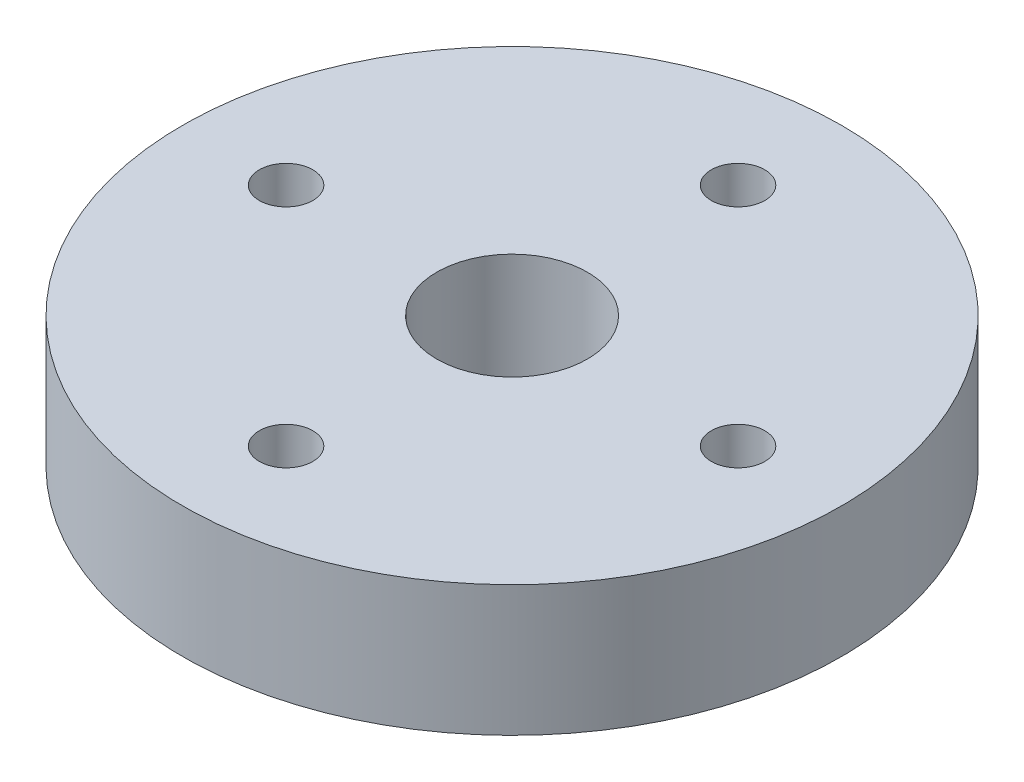
ISO-10303-21;
HEADER;
FILE_DESCRIPTION(('STEP AP214'),'2;1');
FILE_NAME('part.step','',(''),(''),'','','');
FILE_SCHEMA(('AUTOMOTIVE_DESIGN { 1 0 10303 214 1 1 1 1 }'));
ENDSEC;
DATA;
#1=APPLICATION_CONTEXT('core data for automotive mechanical design processes');
#2=APPLICATION_PROTOCOL_DEFINITION('international standard','automotive_design',2000,#1);
#3=PRODUCT_CONTEXT('',#1,'mechanical');
#4=PRODUCT('Part','Part','',(#3));
#5=PRODUCT_RELATED_PRODUCT_CATEGORY('part','',(#4));
#6=PRODUCT_DEFINITION_FORMATION('','',#4);
#7=PRODUCT_DEFINITION_CONTEXT('part definition',#1,'design');
#8=PRODUCT_DEFINITION('design','',#6,#7);
#9=PRODUCT_DEFINITION_SHAPE('','',#8);
#10=(LENGTH_UNIT() NAMED_UNIT(*) SI_UNIT(.MILLI.,.METRE.));
#11=(NAMED_UNIT(*) PLANE_ANGLE_UNIT() SI_UNIT($,.RADIAN.));
#12=(NAMED_UNIT(*) SI_UNIT($,.STERADIAN.) SOLID_ANGLE_UNIT());
#13=UNCERTAINTY_MEASURE_WITH_UNIT(LENGTH_MEASURE(1.E-05),#10,'distance_accuracy_value','');
#14=(GEOMETRIC_REPRESENTATION_CONTEXT(3) GLOBAL_UNCERTAINTY_ASSIGNED_CONTEXT((#13)) GLOBAL_UNIT_ASSIGNED_CONTEXT((#10,
#11,#12)) REPRESENTATION_CONTEXT('',''));
#15=CARTESIAN_POINT('',(0.,0.,0.));
#16=DIRECTION('',(0.,0.,1.));
#17=DIRECTION('',(1.,0.,0.));
#18=AXIS2_PLACEMENT_3D('',#15,#16,#17);
#19=CARTESIAN_POINT('',(0.,6.93,0.));
#20=DIRECTION('',(0.,-1.,0.));
#21=DIRECTION('',(0.,0.,-1.));
#22=AXIS2_PLACEMENT_3D('',#19,#20,#21);
#23=CYLINDRICAL_SURFACE('',#22,17.5);
#24=CARTESIAN_POINT('',(0.,6.93,0.));
#25=DIRECTION('',(0.,1.,0.));
#26=DIRECTION('',(0.,0.,1.));
#27=AXIS2_PLACEMENT_3D('',#24,#25,#26);
#28=CIRCLE('',#27,17.5);
#29=CARTESIAN_POINT('',(0.,6.93,-17.5));
#30=VERTEX_POINT('',#29);
#31=EDGE_CURVE('E10',#30,#30,#28,.T.);
#32=CARTESIAN_POINT('',(0.,0.,0.));
#33=DIRECTION('',(0.,1.,0.));
#34=DIRECTION('',(0.,0.,1.));
#35=AXIS2_PLACEMENT_3D('',#32,#33,#34);
#36=CIRCLE('',#35,17.5);
#37=CARTESIAN_POINT('',(0.,0.,-17.5));
#38=VERTEX_POINT('',#37);
#39=EDGE_CURVE('E34',#38,#38,#36,.T.);
#40=CARTESIAN_POINT('',(0.,6.93,-17.5));
#41=CARTESIAN_POINT('',(0.,6.8578125,-17.5));
#42=CARTESIAN_POINT('',(0.,6.785625,-17.5));
#43=CARTESIAN_POINT('',(0.,6.64125,-17.5));
#44=CARTESIAN_POINT('',(0.,6.5690625,-17.5));
#45=CARTESIAN_POINT('',(0.,6.4246875,-17.5));
#46=CARTESIAN_POINT('',(0.,6.3525,-17.5));
#47=CARTESIAN_POINT('',(0.,6.208125,-17.5));
#48=CARTESIAN_POINT('',(0.,6.1359375,-17.5));
#49=CARTESIAN_POINT('',(0.,5.9915625,-17.5));
#50=CARTESIAN_POINT('',(0.,5.919375,-17.5));
#51=CARTESIAN_POINT('',(0.,5.775,-17.5));
#52=CARTESIAN_POINT('',(0.,5.7028125,-17.5));
#53=CARTESIAN_POINT('',(0.,5.5584375,-17.5));
#54=CARTESIAN_POINT('',(0.,5.48625,-17.5));
#55=CARTESIAN_POINT('',(0.,5.341875,-17.5));
#56=CARTESIAN_POINT('',(0.,5.2696875,-17.5));
#57=CARTESIAN_POINT('',(0.,5.1253125,-17.5));
#58=CARTESIAN_POINT('',(0.,5.053125,-17.5));
#59=CARTESIAN_POINT('',(0.,4.90875,-17.5));
#60=CARTESIAN_POINT('',(0.,4.8365625,-17.5));
#61=CARTESIAN_POINT('',(0.,4.6921875,-17.5));
#62=CARTESIAN_POINT('',(0.,4.62,-17.5));
#63=CARTESIAN_POINT('',(0.,4.475625,-17.5));
#64=CARTESIAN_POINT('',(0.,4.4034375,-17.5));
#65=CARTESIAN_POINT('',(0.,4.2590625,-17.5));
#66=CARTESIAN_POINT('',(0.,4.186875,-17.5));
#67=CARTESIAN_POINT('',(0.,4.0425,-17.5));
#68=CARTESIAN_POINT('',(0.,3.9703125,-17.5));
#69=CARTESIAN_POINT('',(0.,3.8259375,-17.5));
#70=CARTESIAN_POINT('',(0.,3.75375,-17.5));
#71=CARTESIAN_POINT('',(0.,3.609375,-17.5));
#72=CARTESIAN_POINT('',(0.,3.5371875,-17.5));
#73=CARTESIAN_POINT('',(0.,3.3928125,-17.5));
#74=CARTESIAN_POINT('',(0.,3.320625,-17.5));
#75=CARTESIAN_POINT('',(0.,3.17625,-17.5));
#76=CARTESIAN_POINT('',(0.,3.1040625,-17.5));
#77=CARTESIAN_POINT('',(0.,2.9596875,-17.5));
#78=CARTESIAN_POINT('',(0.,2.8875,-17.5));
#79=CARTESIAN_POINT('',(0.,2.743125,-17.5));
#80=CARTESIAN_POINT('',(0.,2.6709375,-17.5));
#81=CARTESIAN_POINT('',(0.,2.5265625,-17.5));
#82=CARTESIAN_POINT('',(0.,2.454375,-17.5));
#83=CARTESIAN_POINT('',(0.,2.31,-17.5));
#84=CARTESIAN_POINT('',(0.,2.2378125,-17.5));
#85=CARTESIAN_POINT('',(0.,2.0934375,-17.5));
#86=CARTESIAN_POINT('',(0.,2.02125,-17.5));
#87=CARTESIAN_POINT('',(0.,1.876875,-17.5));
#88=CARTESIAN_POINT('',(0.,1.8046875,-17.5));
#89=CARTESIAN_POINT('',(0.,1.6603125,-17.5));
#90=CARTESIAN_POINT('',(0.,1.588125,-17.5));
#91=CARTESIAN_POINT('',(0.,1.44375,-17.5));
#92=CARTESIAN_POINT('',(0.,1.3715625,-17.5));
#93=CARTESIAN_POINT('',(0.,1.2271875,-17.5));
#94=CARTESIAN_POINT('',(0.,1.155,-17.5));
#95=CARTESIAN_POINT('',(0.,1.010625,-17.5));
#96=CARTESIAN_POINT('',(0.,0.9384375,-17.5));
#97=CARTESIAN_POINT('',(0.,0.7940625,-17.5));
#98=CARTESIAN_POINT('',(0.,0.721875,-17.5));
#99=CARTESIAN_POINT('',(0.,0.5775,-17.5));
#100=CARTESIAN_POINT('',(0.,0.5053125,-17.5));
#101=CARTESIAN_POINT('',(0.,0.3609375,-17.5));
#102=CARTESIAN_POINT('',(0.,0.28875,-17.5));
#103=CARTESIAN_POINT('',(0.,0.144375,-17.5));
#104=CARTESIAN_POINT('',(0.,0.0721874999999999,-17.5));
#105=CARTESIAN_POINT('',(0.,0.,-17.5));
#106=B_SPLINE_CURVE_WITH_KNOTS('',3,(#40,#41,#42,#43,#44,#45,#46,#47,#48,#49,#50,#51,#52,#53,
#54,#55,#56,#57,#58,#59,#60,#61,#62,#63,#64,#65,#66,#67,#68,#69,#70,#71,#72,#73,#74,#75,#76,#77,
#78,#79,#80,#81,#82,#83,#84,#85,#86,#87,#88,#89,#90,#91,#92,#93,#94,#95,#96,#97,#98,#99,#100,
#101,#102,#103,#104,#105),.UNSPECIFIED.,.F.,.F.,(4,2,2,2,2,2,2,2,2,2,2,2,2,2,2,2,2,2,2,2,2,2,2,
2,2,2,2,2,2,2,2,2,4),(0.,0.2165625,0.433124999999999,0.649687499999999,0.866249999999999,
1.0828125,1.299375,1.5159375,1.7325,1.9490625,2.165625,2.3821875,2.59875,2.8153125,3.031875,
3.2484375,3.465,3.6815625,3.898125,4.1146875,4.33125,4.5478125,4.764375,4.9809375,5.1975,
5.4140625,5.630625,5.8471875,6.06375,6.2803125,6.496875,6.7134375,6.93),.UNSPECIFIED.);
#107=EDGE_CURVE('BSEAM31',#30,#38,#106,.T.);
#108=ORIENTED_EDGE('',*,*,#31,.F.);
#109=ORIENTED_EDGE('',*,*,#39,.T.);
#110=ORIENTED_EDGE('',*,*,#107,.T.);
#111=ORIENTED_EDGE('',*,*,#107,.F.);
#112=EDGE_LOOP('',(#108,#110,#109,#111));
#113=FACE_BOUND('',#112,.T.);
#114=ADVANCED_FACE('F31',(#113),#23,.T.);
#115=CARTESIAN_POINT('',(0.,6.93,0.));
#116=DIRECTION('',(0.,1.,0.));
#117=DIRECTION('',(0.,0.,1.));
#118=AXIS2_PLACEMENT_3D('',#115,#116,#117);
#119=PLANE('',#118);
#120=CARTESIAN_POINT('',(0.,6.93,0.));
#121=DIRECTION('',(0.,1.,0.));
#122=DIRECTION('',(0.,0.,1.));
#123=AXIS2_PLACEMENT_3D('',#120,#121,#122);
#124=CIRCLE('',#123,4.);
#125=CARTESIAN_POINT('',(0.,6.93,4.));
#126=VERTEX_POINT('',#125);
#127=EDGE_CURVE('E67',#126,#126,#124,.T.);
#128=ORIENTED_EDGE('',*,*,#127,.F.);
#129=EDGE_LOOP('',(#128));
#130=FACE_BOUND('',#129,.T.);
#131=CARTESIAN_POINT('',(0.,6.93,-12.));
#132=DIRECTION('',(0.,1.,0.));
#133=DIRECTION('',(0.,0.,1.));
#134=AXIS2_PLACEMENT_3D('',#131,#132,#133);
#135=CIRCLE('',#134,1.41884866442433);
#136=CARTESIAN_POINT('',(0.,6.93,-10.5811513355757));
#137=VERTEX_POINT('',#136);
#138=EDGE_CURVE('E62',#137,#137,#135,.T.);
#139=ORIENTED_EDGE('',*,*,#138,.F.);
#140=EDGE_LOOP('',(#139));
#141=FACE_BOUND('',#140,.T.);
#142=CARTESIAN_POINT('',(12.0000000000003,6.93,-3.38856148926383E-13));
#143=DIRECTION('',(0.,1.,0.));
#144=DIRECTION('',(0.,0.,1.));
#145=AXIS2_PLACEMENT_3D('',#142,#143,#144);
#146=CIRCLE('',#145,1.4188486644246);
#147=CARTESIAN_POINT('',(12.0000000000003,6.93,1.41884866442426));
#148=VERTEX_POINT('',#147);
#149=EDGE_CURVE('E56',#148,#148,#146,.T.);
#150=ORIENTED_EDGE('',*,*,#149,.F.);
#151=EDGE_LOOP('',(#150));
#152=FACE_BOUND('',#151,.T.);
#153=CARTESIAN_POINT('',(6.77712297852766E-13,6.93,12.));
#154=DIRECTION('',(0.,1.,0.));
#155=DIRECTION('',(0.,0.,1.));
#156=AXIS2_PLACEMENT_3D('',#153,#154,#155);
#157=CIRCLE('',#156,1.41884866442506);
#158=CARTESIAN_POINT('',(6.77712297852766E-13,6.93,13.4188486644251));
#159=VERTEX_POINT('',#158);
#160=EDGE_CURVE('E50',#159,#159,#157,.T.);
#161=ORIENTED_EDGE('',*,*,#160,.F.);
#162=EDGE_LOOP('',(#161));
#163=FACE_BOUND('',#162,.T.);
#164=CARTESIAN_POINT('',(-11.9999999999997,6.93,3.4032572508536E-13));
#165=DIRECTION('',(0.,1.,0.));
#166=DIRECTION('',(0.,0.,1.));
#167=AXIS2_PLACEMENT_3D('',#164,#165,#166);
#168=CIRCLE('',#167,1.41884866442487);
#169=CARTESIAN_POINT('',(-11.9999999999997,6.93,1.41884866442521));
#170=VERTEX_POINT('',#169);
#171=EDGE_CURVE('E43',#170,#170,#168,.T.);
#172=ORIENTED_EDGE('',*,*,#171,.F.);
#173=EDGE_LOOP('',(#172));
#174=FACE_BOUND('',#173,.T.);
#175=ORIENTED_EDGE('',*,*,#31,.T.);
#176=EDGE_LOOP('',(#175));
#177=FACE_BOUND('',#176,.T.);
#178=ADVANCED_FACE('F83',(#130,#141,#152,#163,#174,#177),#119,.T.);
#179=CARTESIAN_POINT('',(0.,0.,0.));
#180=DIRECTION('',(0.,1.,0.));
#181=DIRECTION('',(0.,0.,1.));
#182=AXIS2_PLACEMENT_3D('',#179,#180,#181);
#183=PLANE('',#182);
#184=CARTESIAN_POINT('',(0.,0.,0.));
#185=DIRECTION('',(0.,1.,0.));
#186=DIRECTION('',(0.,0.,1.));
#187=AXIS2_PLACEMENT_3D('',#184,#185,#186);
#188=CIRCLE('',#187,4.);
#189=CARTESIAN_POINT('',(0.,0.,4.));
#190=VERTEX_POINT('',#189);
#191=EDGE_CURVE('E47',#190,#190,#188,.T.);
#192=ORIENTED_EDGE('',*,*,#191,.T.);
#193=EDGE_LOOP('',(#192));
#194=FACE_BOUND('',#193,.T.);
#195=CARTESIAN_POINT('',(0.,0.,-12.));
#196=DIRECTION('',(0.,1.,0.));
#197=DIRECTION('',(0.,0.,1.));
#198=AXIS2_PLACEMENT_3D('',#195,#196,#197);
#199=CIRCLE('',#198,1.41884866442433);
#200=CARTESIAN_POINT('',(0.,0.,-10.5811513355757));
#201=VERTEX_POINT('',#200);
#202=EDGE_CURVE('E41',#201,#201,#199,.T.);
#203=ORIENTED_EDGE('',*,*,#202,.T.);
#204=EDGE_LOOP('',(#203));
#205=FACE_BOUND('',#204,.T.);
#206=CARTESIAN_POINT('',(12.0000000000003,0.,-3.38856148926383E-13));
#207=DIRECTION('',(0.,1.,0.));
#208=DIRECTION('',(0.,0.,1.));
#209=AXIS2_PLACEMENT_3D('',#206,#207,#208);
#210=CIRCLE('',#209,1.4188486644246);
#211=CARTESIAN_POINT('',(12.0000000000003,0.,1.41884866442426));
#212=VERTEX_POINT('',#211);
#213=EDGE_CURVE('E59',#212,#212,#210,.T.);
#214=ORIENTED_EDGE('',*,*,#213,.T.);
#215=EDGE_LOOP('',(#214));
#216=FACE_BOUND('',#215,.T.);
#217=CARTESIAN_POINT('',(6.77712297852766E-13,0.,12.));
#218=DIRECTION('',(0.,1.,0.));
#219=DIRECTION('',(0.,0.,1.));
#220=AXIS2_PLACEMENT_3D('',#217,#218,#219);
#221=CIRCLE('',#220,1.41884866442506);
#222=CARTESIAN_POINT('',(6.77712297852766E-13,0.,13.4188486644251));
#223=VERTEX_POINT('',#222);
#224=EDGE_CURVE('E53',#223,#223,#221,.T.);
#225=ORIENTED_EDGE('',*,*,#224,.T.);
#226=EDGE_LOOP('',(#225));
#227=FACE_BOUND('',#226,.T.);
#228=CARTESIAN_POINT('',(-11.9999999999997,0.,3.4032572508536E-13));
#229=DIRECTION('',(0.,1.,0.));
#230=DIRECTION('',(0.,0.,1.));
#231=AXIS2_PLACEMENT_3D('',#228,#229,#230);
#232=CIRCLE('',#231,1.41884866442487);
#233=CARTESIAN_POINT('',(-11.9999999999997,0.,1.41884866442521));
#234=VERTEX_POINT('',#233);
#235=EDGE_CURVE('E46',#234,#234,#232,.T.);
#236=ORIENTED_EDGE('',*,*,#235,.T.);
#237=EDGE_LOOP('',(#236));
#238=FACE_BOUND('',#237,.T.);
#239=ORIENTED_EDGE('',*,*,#39,.F.);
#240=EDGE_LOOP('',(#239));
#241=FACE_BOUND('',#240,.T.);
#242=ADVANCED_FACE('F73',(#194,#205,#216,#227,#238,#241),#183,.F.);
#243=CARTESIAN_POINT('',(-11.9999999999997,0.,3.4032572508536E-13));
#244=DIRECTION('',(0.,1.,0.));
#245=DIRECTION('',(0.,0.,1.));
#246=AXIS2_PLACEMENT_3D('',#243,#244,#245);
#247=CYLINDRICAL_SURFACE('',#246,1.41884866442487);
#248=CARTESIAN_POINT('',(-11.9999999999997,0.,1.41884866442521));
#249=CARTESIAN_POINT('',(-11.9999999999997,0.0721875,1.41884866442521));
#250=CARTESIAN_POINT('',(-11.9999999999997,0.144375,1.41884866442521));
#251=CARTESIAN_POINT('',(-11.9999999999997,0.28875,1.41884866442521));
#252=CARTESIAN_POINT('',(-11.9999999999997,0.3609375,1.41884866442521));
#253=CARTESIAN_POINT('',(-11.9999999999997,0.5053125,1.41884866442521));
#254=CARTESIAN_POINT('',(-11.9999999999997,0.5775,1.41884866442521));
#255=CARTESIAN_POINT('',(-11.9999999999997,0.721875,1.41884866442521));
#256=CARTESIAN_POINT('',(-11.9999999999997,0.7940625,1.41884866442521));
#257=CARTESIAN_POINT('',(-11.9999999999997,0.9384375,1.41884866442521));
#258=CARTESIAN_POINT('',(-11.9999999999997,1.010625,1.41884866442521));
#259=CARTESIAN_POINT('',(-11.9999999999997,1.155,1.41884866442521));
#260=CARTESIAN_POINT('',(-11.9999999999997,1.2271875,1.41884866442521));
#261=CARTESIAN_POINT('',(-11.9999999999997,1.3715625,1.41884866442521));
#262=CARTESIAN_POINT('',(-11.9999999999997,1.44375,1.41884866442521));
#263=CARTESIAN_POINT('',(-11.9999999999997,1.588125,1.41884866442521));
#264=CARTESIAN_POINT('',(-11.9999999999997,1.6603125,1.41884866442521));
#265=CARTESIAN_POINT('',(-11.9999999999997,1.8046875,1.41884866442521));
#266=CARTESIAN_POINT('',(-11.9999999999997,1.876875,1.41884866442521));
#267=CARTESIAN_POINT('',(-11.9999999999997,2.02125,1.41884866442521));
#268=CARTESIAN_POINT('',(-11.9999999999997,2.0934375,1.41884866442521));
#269=CARTESIAN_POINT('',(-11.9999999999997,2.2378125,1.41884866442521));
#270=CARTESIAN_POINT('',(-11.9999999999997,2.31,1.41884866442521));
#271=CARTESIAN_POINT('',(-11.9999999999997,2.454375,1.41884866442521));
#272=CARTESIAN_POINT('',(-11.9999999999997,2.5265625,1.41884866442521));
#273=CARTESIAN_POINT('',(-11.9999999999997,2.6709375,1.41884866442521));
#274=CARTESIAN_POINT('',(-11.9999999999997,2.743125,1.41884866442521));
#275=CARTESIAN_POINT('',(-11.9999999999997,2.8875,1.41884866442521));
#276=CARTESIAN_POINT('',(-11.9999999999997,2.9596875,1.41884866442521));
#277=CARTESIAN_POINT('',(-11.9999999999997,3.1040625,1.41884866442521));
#278=CARTESIAN_POINT('',(-11.9999999999997,3.17625,1.41884866442521));
#279=CARTESIAN_POINT('',(-11.9999999999997,3.320625,1.41884866442521));
#280=CARTESIAN_POINT('',(-11.9999999999997,3.3928125,1.41884866442521));
#281=CARTESIAN_POINT('',(-11.9999999999997,3.5371875,1.41884866442521));
#282=CARTESIAN_POINT('',(-11.9999999999997,3.609375,1.41884866442521));
#283=CARTESIAN_POINT('',(-11.9999999999997,3.75375,1.41884866442521));
#284=CARTESIAN_POINT('',(-11.9999999999997,3.8259375,1.41884866442521));
#285=CARTESIAN_POINT('',(-11.9999999999997,3.9703125,1.41884866442521));
#286=CARTESIAN_POINT('',(-11.9999999999997,4.0425,1.41884866442521));
#287=CARTESIAN_POINT('',(-11.9999999999997,4.186875,1.41884866442521));
#288=CARTESIAN_POINT('',(-11.9999999999997,4.2590625,1.41884866442521));
#289=CARTESIAN_POINT('',(-11.9999999999997,4.4034375,1.41884866442521));
#290=CARTESIAN_POINT('',(-11.9999999999997,4.475625,1.41884866442521));
#291=CARTESIAN_POINT('',(-11.9999999999997,4.62,1.41884866442521));
#292=CARTESIAN_POINT('',(-11.9999999999997,4.6921875,1.41884866442521));
#293=CARTESIAN_POINT('',(-11.9999999999997,4.8365625,1.41884866442521));
#294=CARTESIAN_POINT('',(-11.9999999999997,4.90875,1.41884866442521));
#295=CARTESIAN_POINT('',(-11.9999999999997,5.053125,1.41884866442521));
#296=CARTESIAN_POINT('',(-11.9999999999997,5.1253125,1.41884866442521));
#297=CARTESIAN_POINT('',(-11.9999999999997,5.2696875,1.41884866442521));
#298=CARTESIAN_POINT('',(-11.9999999999997,5.341875,1.41884866442521));
#299=CARTESIAN_POINT('',(-11.9999999999997,5.48625,1.41884866442521));
#300=CARTESIAN_POINT('',(-11.9999999999997,5.5584375,1.41884866442521));
#301=CARTESIAN_POINT('',(-11.9999999999997,5.7028125,1.41884866442521));
#302=CARTESIAN_POINT('',(-11.9999999999997,5.775,1.41884866442521));
#303=CARTESIAN_POINT('',(-11.9999999999997,5.919375,1.41884866442521));
#304=CARTESIAN_POINT('',(-11.9999999999997,5.9915625,1.41884866442521));
#305=CARTESIAN_POINT('',(-11.9999999999997,6.1359375,1.41884866442521));
#306=CARTESIAN_POINT('',(-11.9999999999997,6.208125,1.41884866442521));
#307=CARTESIAN_POINT('',(-11.9999999999997,6.3525,1.41884866442521));
#308=CARTESIAN_POINT('',(-11.9999999999997,6.4246875,1.41884866442521));
#309=CARTESIAN_POINT('',(-11.9999999999997,6.5690625,1.41884866442521));
#310=CARTESIAN_POINT('',(-11.9999999999997,6.64125,1.41884866442521));
#311=CARTESIAN_POINT('',(-11.9999999999997,6.785625,1.41884866442521));
#312=CARTESIAN_POINT('',(-11.9999999999997,6.8578125,1.41884866442521));
#313=CARTESIAN_POINT('',(-11.9999999999997,6.93,1.41884866442521));
#314=B_SPLINE_CURVE_WITH_KNOTS('',3,(#248,#249,#250,#251,#252,#253,#254,#255,#256,#257,#258,
#259,#260,#261,#262,#263,#264,#265,#266,#267,#268,#269,#270,#271,#272,#273,#274,#275,#276,#277,
#278,#279,#280,#281,#282,#283,#284,#285,#286,#287,#288,#289,#290,#291,#292,#293,#294,#295,#296,
#297,#298,#299,#300,#301,#302,#303,#304,#305,#306,#307,#308,#309,#310,#311,#312,#313),
.UNSPECIFIED.,.F.,.F.,(4,2,2,2,2,2,2,2,2,2,2,2,2,2,2,2,2,2,2,2,2,2,2,2,2,2,2,2,2,2,2,2,4),(0.,
0.2165625,0.433125,0.6496875,0.86625,1.0828125,1.299375,1.5159375,1.7325,1.9490625,2.165625,
2.3821875,2.59875,2.8153125,3.031875,3.2484375,3.465,3.6815625,3.898125,4.1146875,4.33125,
4.5478125,4.764375,4.9809375,5.1975,5.4140625,5.630625,5.8471875,6.06375,6.2803125,6.496875,
6.7134375,6.93),.UNSPECIFIED.);
#315=EDGE_CURVE('BSEAM95',#234,#170,#314,.T.);
#316=ORIENTED_EDGE('',*,*,#235,.F.);
#317=ORIENTED_EDGE('',*,*,#171,.T.);
#318=ORIENTED_EDGE('',*,*,#315,.T.);
#319=ORIENTED_EDGE('',*,*,#315,.F.);
#320=EDGE_LOOP('',(#316,#318,#317,#319));
#321=FACE_BOUND('',#320,.T.);
#322=ADVANCED_FACE('F95',(#321),#247,.F.);
#323=CARTESIAN_POINT('',(6.77712297852766E-13,0.,12.));
#324=DIRECTION('',(0.,1.,0.));
#325=DIRECTION('',(0.,0.,1.));
#326=AXIS2_PLACEMENT_3D('',#323,#324,#325);
#327=CYLINDRICAL_SURFACE('',#326,1.41884866442506);
#328=CARTESIAN_POINT('',(6.77712297852766E-13,0.,13.4188486644251));
#329=CARTESIAN_POINT('',(6.77712297852766E-13,0.0721875,13.4188486644251));
#330=CARTESIAN_POINT('',(6.77712297852766E-13,0.144375,13.4188486644251));
#331=CARTESIAN_POINT('',(6.77712297852766E-13,0.28875,13.4188486644251));
#332=CARTESIAN_POINT('',(6.77712297852766E-13,0.3609375,13.4188486644251));
#333=CARTESIAN_POINT('',(6.77712297852766E-13,0.5053125,13.4188486644251));
#334=CARTESIAN_POINT('',(6.77712297852766E-13,0.5775,13.4188486644251));
#335=CARTESIAN_POINT('',(6.77712297852766E-13,0.721875,13.4188486644251));
#336=CARTESIAN_POINT('',(6.77712297852766E-13,0.7940625,13.4188486644251));
#337=CARTESIAN_POINT('',(6.77712297852766E-13,0.9384375,13.4188486644251));
#338=CARTESIAN_POINT('',(6.77712297852766E-13,1.010625,13.4188486644251));
#339=CARTESIAN_POINT('',(6.77712297852766E-13,1.155,13.4188486644251));
#340=CARTESIAN_POINT('',(6.77712297852766E-13,1.2271875,13.4188486644251));
#341=CARTESIAN_POINT('',(6.77712297852766E-13,1.3715625,13.4188486644251));
#342=CARTESIAN_POINT('',(6.77712297852766E-13,1.44375,13.4188486644251));
#343=CARTESIAN_POINT('',(6.77712297852766E-13,1.588125,13.4188486644251));
#344=CARTESIAN_POINT('',(6.77712297852766E-13,1.6603125,13.4188486644251));
#345=CARTESIAN_POINT('',(6.77712297852766E-13,1.8046875,13.4188486644251));
#346=CARTESIAN_POINT('',(6.77712297852766E-13,1.876875,13.4188486644251));
#347=CARTESIAN_POINT('',(6.77712297852766E-13,2.02125,13.4188486644251));
#348=CARTESIAN_POINT('',(6.77712297852766E-13,2.0934375,13.4188486644251));
#349=CARTESIAN_POINT('',(6.77712297852766E-13,2.2378125,13.4188486644251));
#350=CARTESIAN_POINT('',(6.77712297852766E-13,2.31,13.4188486644251));
#351=CARTESIAN_POINT('',(6.77712297852766E-13,2.454375,13.4188486644251));
#352=CARTESIAN_POINT('',(6.77712297852766E-13,2.5265625,13.4188486644251));
#353=CARTESIAN_POINT('',(6.77712297852766E-13,2.6709375,13.4188486644251));
#354=CARTESIAN_POINT('',(6.77712297852766E-13,2.743125,13.4188486644251));
#355=CARTESIAN_POINT('',(6.77712297852766E-13,2.8875,13.4188486644251));
#356=CARTESIAN_POINT('',(6.77712297852766E-13,2.9596875,13.4188486644251));
#357=CARTESIAN_POINT('',(6.77712297852766E-13,3.1040625,13.4188486644251));
#358=CARTESIAN_POINT('',(6.77712297852766E-13,3.17625,13.4188486644251));
#359=CARTESIAN_POINT('',(6.77712297852766E-13,3.320625,13.4188486644251));
#360=CARTESIAN_POINT('',(6.77712297852766E-13,3.3928125,13.4188486644251));
#361=CARTESIAN_POINT('',(6.77712297852766E-13,3.5371875,13.4188486644251));
#362=CARTESIAN_POINT('',(6.77712297852766E-13,3.609375,13.4188486644251));
#363=CARTESIAN_POINT('',(6.77712297852766E-13,3.75375,13.4188486644251));
#364=CARTESIAN_POINT('',(6.77712297852766E-13,3.8259375,13.4188486644251));
#365=CARTESIAN_POINT('',(6.77712297852766E-13,3.9703125,13.4188486644251));
#366=CARTESIAN_POINT('',(6.77712297852766E-13,4.0425,13.4188486644251));
#367=CARTESIAN_POINT('',(6.77712297852766E-13,4.186875,13.4188486644251));
#368=CARTESIAN_POINT('',(6.77712297852766E-13,4.2590625,13.4188486644251));
#369=CARTESIAN_POINT('',(6.77712297852766E-13,4.4034375,13.4188486644251));
#370=CARTESIAN_POINT('',(6.77712297852766E-13,4.475625,13.4188486644251));
#371=CARTESIAN_POINT('',(6.77712297852766E-13,4.62,13.4188486644251));
#372=CARTESIAN_POINT('',(6.77712297852766E-13,4.6921875,13.4188486644251));
#373=CARTESIAN_POINT('',(6.77712297852766E-13,4.8365625,13.4188486644251));
#374=CARTESIAN_POINT('',(6.77712297852766E-13,4.90875,13.4188486644251));
#375=CARTESIAN_POINT('',(6.77712297852766E-13,5.053125,13.4188486644251));
#376=CARTESIAN_POINT('',(6.77712297852766E-13,5.1253125,13.4188486644251));
#377=CARTESIAN_POINT('',(6.77712297852766E-13,5.2696875,13.4188486644251));
#378=CARTESIAN_POINT('',(6.77712297852766E-13,5.341875,13.4188486644251));
#379=CARTESIAN_POINT('',(6.77712297852766E-13,5.48625,13.4188486644251));
#380=CARTESIAN_POINT('',(6.77712297852766E-13,5.5584375,13.4188486644251));
#381=CARTESIAN_POINT('',(6.77712297852766E-13,5.7028125,13.4188486644251));
#382=CARTESIAN_POINT('',(6.77712297852766E-13,5.775,13.4188486644251));
#383=CARTESIAN_POINT('',(6.77712297852766E-13,5.919375,13.4188486644251));
#384=CARTESIAN_POINT('',(6.77712297852766E-13,5.9915625,13.4188486644251));
#385=CARTESIAN_POINT('',(6.77712297852766E-13,6.1359375,13.4188486644251));
#386=CARTESIAN_POINT('',(6.77712297852766E-13,6.208125,13.4188486644251));
#387=CARTESIAN_POINT('',(6.77712297852766E-13,6.3525,13.4188486644251));
#388=CARTESIAN_POINT('',(6.77712297852766E-13,6.4246875,13.4188486644251));
#389=CARTESIAN_POINT('',(6.77712297852766E-13,6.5690625,13.4188486644251));
#390=CARTESIAN_POINT('',(6.77712297852766E-13,6.64125,13.4188486644251));
#391=CARTESIAN_POINT('',(6.77712297852766E-13,6.785625,13.4188486644251));
#392=CARTESIAN_POINT('',(6.77712297852766E-13,6.8578125,13.4188486644251));
#393=CARTESIAN_POINT('',(6.77712297852766E-13,6.93,13.4188486644251));
#394=B_SPLINE_CURVE_WITH_KNOTS('',3,(#328,#329,#330,#331,#332,#333,#334,#335,#336,#337,#338,
#339,#340,#341,#342,#343,#344,#345,#346,#347,#348,#349,#350,#351,#352,#353,#354,#355,#356,#357,
#358,#359,#360,#361,#362,#363,#364,#365,#366,#367,#368,#369,#370,#371,#372,#373,#374,#375,#376,
#377,#378,#379,#380,#381,#382,#383,#384,#385,#386,#387,#388,#389,#390,#391,#392,#393),
.UNSPECIFIED.,.F.,.F.,(4,2,2,2,2,2,2,2,2,2,2,2,2,2,2,2,2,2,2,2,2,2,2,2,2,2,2,2,2,2,2,2,4),(0.,
0.2165625,0.433125,0.6496875,0.86625,1.0828125,1.299375,1.5159375,1.7325,1.9490625,2.165625,
2.3821875,2.59875,2.8153125,3.031875,3.2484375,3.465,3.6815625,3.898125,4.1146875,4.33125,
4.5478125,4.764375,4.9809375,5.1975,5.4140625,5.630625,5.8471875,6.06375,6.2803125,6.496875,
6.7134375,6.93),.UNSPECIFIED.);
#395=EDGE_CURVE('BSEAM97',#223,#159,#394,.T.);
#396=ORIENTED_EDGE('',*,*,#224,.F.);
#397=ORIENTED_EDGE('',*,*,#160,.T.);
#398=ORIENTED_EDGE('',*,*,#395,.T.);
#399=ORIENTED_EDGE('',*,*,#395,.F.);
#400=EDGE_LOOP('',(#396,#398,#397,#399));
#401=FACE_BOUND('',#400,.T.);
#402=ADVANCED_FACE('F97',(#401),#327,.F.);
#403=CARTESIAN_POINT('',(12.0000000000003,0.,-3.38856148926383E-13));
#404=DIRECTION('',(0.,1.,0.));
#405=DIRECTION('',(0.,0.,1.));
#406=AXIS2_PLACEMENT_3D('',#403,#404,#405);
#407=CYLINDRICAL_SURFACE('',#406,1.4188486644246);
#408=CARTESIAN_POINT('',(12.0000000000003,0.,1.41884866442426));
#409=CARTESIAN_POINT('',(12.0000000000003,0.0721875,1.41884866442426));
#410=CARTESIAN_POINT('',(12.0000000000003,0.144375,1.41884866442426));
#411=CARTESIAN_POINT('',(12.0000000000003,0.28875,1.41884866442426));
#412=CARTESIAN_POINT('',(12.0000000000003,0.3609375,1.41884866442426));
#413=CARTESIAN_POINT('',(12.0000000000003,0.5053125,1.41884866442426));
#414=CARTESIAN_POINT('',(12.0000000000003,0.5775,1.41884866442426));
#415=CARTESIAN_POINT('',(12.0000000000003,0.721875,1.41884866442426));
#416=CARTESIAN_POINT('',(12.0000000000003,0.7940625,1.41884866442426));
#417=CARTESIAN_POINT('',(12.0000000000003,0.9384375,1.41884866442426));
#418=CARTESIAN_POINT('',(12.0000000000003,1.010625,1.41884866442426));
#419=CARTESIAN_POINT('',(12.0000000000003,1.155,1.41884866442426));
#420=CARTESIAN_POINT('',(12.0000000000003,1.2271875,1.41884866442426));
#421=CARTESIAN_POINT('',(12.0000000000003,1.3715625,1.41884866442426));
#422=CARTESIAN_POINT('',(12.0000000000003,1.44375,1.41884866442426));
#423=CARTESIAN_POINT('',(12.0000000000003,1.588125,1.41884866442426));
#424=CARTESIAN_POINT('',(12.0000000000003,1.6603125,1.41884866442426));
#425=CARTESIAN_POINT('',(12.0000000000003,1.8046875,1.41884866442426));
#426=CARTESIAN_POINT('',(12.0000000000003,1.876875,1.41884866442426));
#427=CARTESIAN_POINT('',(12.0000000000003,2.02125,1.41884866442426));
#428=CARTESIAN_POINT('',(12.0000000000003,2.0934375,1.41884866442426));
#429=CARTESIAN_POINT('',(12.0000000000003,2.2378125,1.41884866442426));
#430=CARTESIAN_POINT('',(12.0000000000003,2.31,1.41884866442426));
#431=CARTESIAN_POINT('',(12.0000000000003,2.454375,1.41884866442426));
#432=CARTESIAN_POINT('',(12.0000000000003,2.5265625,1.41884866442426));
#433=CARTESIAN_POINT('',(12.0000000000003,2.6709375,1.41884866442426));
#434=CARTESIAN_POINT('',(12.0000000000003,2.743125,1.41884866442426));
#435=CARTESIAN_POINT('',(12.0000000000003,2.8875,1.41884866442426));
#436=CARTESIAN_POINT('',(12.0000000000003,2.9596875,1.41884866442426));
#437=CARTESIAN_POINT('',(12.0000000000003,3.1040625,1.41884866442426));
#438=CARTESIAN_POINT('',(12.0000000000003,3.17625,1.41884866442426));
#439=CARTESIAN_POINT('',(12.0000000000003,3.320625,1.41884866442426));
#440=CARTESIAN_POINT('',(12.0000000000003,3.3928125,1.41884866442426));
#441=CARTESIAN_POINT('',(12.0000000000003,3.5371875,1.41884866442426));
#442=CARTESIAN_POINT('',(12.0000000000003,3.609375,1.41884866442426));
#443=CARTESIAN_POINT('',(12.0000000000003,3.75375,1.41884866442426));
#444=CARTESIAN_POINT('',(12.0000000000003,3.8259375,1.41884866442426));
#445=CARTESIAN_POINT('',(12.0000000000003,3.9703125,1.41884866442426));
#446=CARTESIAN_POINT('',(12.0000000000003,4.0425,1.41884866442426));
#447=CARTESIAN_POINT('',(12.0000000000003,4.186875,1.41884866442426));
#448=CARTESIAN_POINT('',(12.0000000000003,4.2590625,1.41884866442426));
#449=CARTESIAN_POINT('',(12.0000000000003,4.4034375,1.41884866442426));
#450=CARTESIAN_POINT('',(12.0000000000003,4.475625,1.41884866442426));
#451=CARTESIAN_POINT('',(12.0000000000003,4.62,1.41884866442426));
#452=CARTESIAN_POINT('',(12.0000000000003,4.6921875,1.41884866442426));
#453=CARTESIAN_POINT('',(12.0000000000003,4.8365625,1.41884866442426));
#454=CARTESIAN_POINT('',(12.0000000000003,4.90875,1.41884866442426));
#455=CARTESIAN_POINT('',(12.0000000000003,5.053125,1.41884866442426));
#456=CARTESIAN_POINT('',(12.0000000000003,5.1253125,1.41884866442426));
#457=CARTESIAN_POINT('',(12.0000000000003,5.2696875,1.41884866442426));
#458=CARTESIAN_POINT('',(12.0000000000003,5.341875,1.41884866442426));
#459=CARTESIAN_POINT('',(12.0000000000003,5.48625,1.41884866442426));
#460=CARTESIAN_POINT('',(12.0000000000003,5.5584375,1.41884866442426));
#461=CARTESIAN_POINT('',(12.0000000000003,5.7028125,1.41884866442426));
#462=CARTESIAN_POINT('',(12.0000000000003,5.775,1.41884866442426));
#463=CARTESIAN_POINT('',(12.0000000000003,5.919375,1.41884866442426));
#464=CARTESIAN_POINT('',(12.0000000000003,5.9915625,1.41884866442426));
#465=CARTESIAN_POINT('',(12.0000000000003,6.1359375,1.41884866442426));
#466=CARTESIAN_POINT('',(12.0000000000003,6.208125,1.41884866442426));
#467=CARTESIAN_POINT('',(12.0000000000003,6.3525,1.41884866442426));
#468=CARTESIAN_POINT('',(12.0000000000003,6.4246875,1.41884866442426));
#469=CARTESIAN_POINT('',(12.0000000000003,6.5690625,1.41884866442426));
#470=CARTESIAN_POINT('',(12.0000000000003,6.64125,1.41884866442426));
#471=CARTESIAN_POINT('',(12.0000000000003,6.785625,1.41884866442426));
#472=CARTESIAN_POINT('',(12.0000000000003,6.8578125,1.41884866442426));
#473=CARTESIAN_POINT('',(12.0000000000003,6.93,1.41884866442426));
#474=B_SPLINE_CURVE_WITH_KNOTS('',3,(#408,#409,#410,#411,#412,#413,#414,#415,#416,#417,#418,
#419,#420,#421,#422,#423,#424,#425,#426,#427,#428,#429,#430,#431,#432,#433,#434,#435,#436,#437,
#438,#439,#440,#441,#442,#443,#444,#445,#446,#447,#448,#449,#450,#451,#452,#453,#454,#455,#456,
#457,#458,#459,#460,#461,#462,#463,#464,#465,#466,#467,#468,#469,#470,#471,#472,#473),
.UNSPECIFIED.,.F.,.F.,(4,2,2,2,2,2,2,2,2,2,2,2,2,2,2,2,2,2,2,2,2,2,2,2,2,2,2,2,2,2,2,2,4),(0.,
0.2165625,0.433125,0.6496875,0.86625,1.0828125,1.299375,1.5159375,1.7325,1.9490625,2.165625,
2.3821875,2.59875,2.8153125,3.031875,3.2484375,3.465,3.6815625,3.898125,4.1146875,4.33125,
4.5478125,4.764375,4.9809375,5.1975,5.4140625,5.630625,5.8471875,6.06375,6.2803125,6.496875,
6.7134375,6.93),.UNSPECIFIED.);
#475=EDGE_CURVE('BSEAM104',#212,#148,#474,.T.);
#476=ORIENTED_EDGE('',*,*,#213,.F.);
#477=ORIENTED_EDGE('',*,*,#149,.T.);
#478=ORIENTED_EDGE('',*,*,#475,.T.);
#479=ORIENTED_EDGE('',*,*,#475,.F.);
#480=EDGE_LOOP('',(#476,#478,#477,#479));
#481=FACE_BOUND('',#480,.T.);
#482=ADVANCED_FACE('F104',(#481),#407,.F.);
#483=CARTESIAN_POINT('',(0.,0.,-12.));
#484=DIRECTION('',(0.,1.,0.));
#485=DIRECTION('',(0.,0.,1.));
#486=AXIS2_PLACEMENT_3D('',#483,#484,#485);
#487=CYLINDRICAL_SURFACE('',#486,1.41884866442433);
#488=CARTESIAN_POINT('',(0.,0.,-10.5811513355757));
#489=CARTESIAN_POINT('',(0.,0.0721875,-10.5811513355757));
#490=CARTESIAN_POINT('',(0.,0.144375,-10.5811513355757));
#491=CARTESIAN_POINT('',(0.,0.28875,-10.5811513355757));
#492=CARTESIAN_POINT('',(0.,0.3609375,-10.5811513355757));
#493=CARTESIAN_POINT('',(0.,0.5053125,-10.5811513355757));
#494=CARTESIAN_POINT('',(0.,0.5775,-10.5811513355757));
#495=CARTESIAN_POINT('',(0.,0.721875,-10.5811513355757));
#496=CARTESIAN_POINT('',(0.,0.7940625,-10.5811513355757));
#497=CARTESIAN_POINT('',(0.,0.9384375,-10.5811513355757));
#498=CARTESIAN_POINT('',(0.,1.010625,-10.5811513355757));
#499=CARTESIAN_POINT('',(0.,1.155,-10.5811513355757));
#500=CARTESIAN_POINT('',(0.,1.2271875,-10.5811513355757));
#501=CARTESIAN_POINT('',(0.,1.3715625,-10.5811513355757));
#502=CARTESIAN_POINT('',(0.,1.44375,-10.5811513355757));
#503=CARTESIAN_POINT('',(0.,1.588125,-10.5811513355757));
#504=CARTESIAN_POINT('',(0.,1.6603125,-10.5811513355757));
#505=CARTESIAN_POINT('',(0.,1.8046875,-10.5811513355757));
#506=CARTESIAN_POINT('',(0.,1.876875,-10.5811513355757));
#507=CARTESIAN_POINT('',(0.,2.02125,-10.5811513355757));
#508=CARTESIAN_POINT('',(0.,2.0934375,-10.5811513355757));
#509=CARTESIAN_POINT('',(0.,2.2378125,-10.5811513355757));
#510=CARTESIAN_POINT('',(0.,2.31,-10.5811513355757));
#511=CARTESIAN_POINT('',(0.,2.454375,-10.5811513355757));
#512=CARTESIAN_POINT('',(0.,2.5265625,-10.5811513355757));
#513=CARTESIAN_POINT('',(0.,2.6709375,-10.5811513355757));
#514=CARTESIAN_POINT('',(0.,2.743125,-10.5811513355757));
#515=CARTESIAN_POINT('',(0.,2.8875,-10.5811513355757));
#516=CARTESIAN_POINT('',(0.,2.9596875,-10.5811513355757));
#517=CARTESIAN_POINT('',(0.,3.1040625,-10.5811513355757));
#518=CARTESIAN_POINT('',(0.,3.17625,-10.5811513355757));
#519=CARTESIAN_POINT('',(0.,3.320625,-10.5811513355757));
#520=CARTESIAN_POINT('',(0.,3.3928125,-10.5811513355757));
#521=CARTESIAN_POINT('',(0.,3.5371875,-10.5811513355757));
#522=CARTESIAN_POINT('',(0.,3.609375,-10.5811513355757));
#523=CARTESIAN_POINT('',(0.,3.75375,-10.5811513355757));
#524=CARTESIAN_POINT('',(0.,3.8259375,-10.5811513355757));
#525=CARTESIAN_POINT('',(0.,3.9703125,-10.5811513355757));
#526=CARTESIAN_POINT('',(0.,4.0425,-10.5811513355757));
#527=CARTESIAN_POINT('',(0.,4.186875,-10.5811513355757));
#528=CARTESIAN_POINT('',(0.,4.2590625,-10.5811513355757));
#529=CARTESIAN_POINT('',(0.,4.4034375,-10.5811513355757));
#530=CARTESIAN_POINT('',(0.,4.475625,-10.5811513355757));
#531=CARTESIAN_POINT('',(0.,4.62,-10.5811513355757));
#532=CARTESIAN_POINT('',(0.,4.6921875,-10.5811513355757));
#533=CARTESIAN_POINT('',(0.,4.8365625,-10.5811513355757));
#534=CARTESIAN_POINT('',(0.,4.90875,-10.5811513355757));
#535=CARTESIAN_POINT('',(0.,5.053125,-10.5811513355757));
#536=CARTESIAN_POINT('',(0.,5.1253125,-10.5811513355757));
#537=CARTESIAN_POINT('',(0.,5.2696875,-10.5811513355757));
#538=CARTESIAN_POINT('',(0.,5.341875,-10.5811513355757));
#539=CARTESIAN_POINT('',(0.,5.48625,-10.5811513355757));
#540=CARTESIAN_POINT('',(0.,5.5584375,-10.5811513355757));
#541=CARTESIAN_POINT('',(0.,5.7028125,-10.5811513355757));
#542=CARTESIAN_POINT('',(0.,5.775,-10.5811513355757));
#543=CARTESIAN_POINT('',(0.,5.919375,-10.5811513355757));
#544=CARTESIAN_POINT('',(0.,5.9915625,-10.5811513355757));
#545=CARTESIAN_POINT('',(0.,6.1359375,-10.5811513355757));
#546=CARTESIAN_POINT('',(0.,6.208125,-10.5811513355757));
#547=CARTESIAN_POINT('',(0.,6.3525,-10.5811513355757));
#548=CARTESIAN_POINT('',(0.,6.4246875,-10.5811513355757));
#549=CARTESIAN_POINT('',(0.,6.5690625,-10.5811513355757));
#550=CARTESIAN_POINT('',(0.,6.64125,-10.5811513355757));
#551=CARTESIAN_POINT('',(0.,6.785625,-10.5811513355757));
#552=CARTESIAN_POINT('',(0.,6.8578125,-10.5811513355757));
#553=CARTESIAN_POINT('',(0.,6.93,-10.5811513355757));
#554=B_SPLINE_CURVE_WITH_KNOTS('',3,(#488,#489,#490,#491,#492,#493,#494,#495,#496,#497,#498,
#499,#500,#501,#502,#503,#504,#505,#506,#507,#508,#509,#510,#511,#512,#513,#514,#515,#516,#517,
#518,#519,#520,#521,#522,#523,#524,#525,#526,#527,#528,#529,#530,#531,#532,#533,#534,#535,#536,
#537,#538,#539,#540,#541,#542,#543,#544,#545,#546,#547,#548,#549,#550,#551,#552,#553),
.UNSPECIFIED.,.F.,.F.,(4,2,2,2,2,2,2,2,2,2,2,2,2,2,2,2,2,2,2,2,2,2,2,2,2,2,2,2,2,2,2,2,4),(0.,
0.2165625,0.433125,0.6496875,0.86625,1.0828125,1.299375,1.5159375,1.7325,1.9490625,2.165625,
2.3821875,2.59875,2.8153125,3.031875,3.2484375,3.465,3.6815625,3.898125,4.1146875,4.33125,
4.5478125,4.764375,4.9809375,5.1975,5.4140625,5.630625,5.8471875,6.06375,6.2803125,6.496875,
6.7134375,6.93),.UNSPECIFIED.);
#555=EDGE_CURVE('BSEAM79',#201,#137,#554,.T.);
#556=ORIENTED_EDGE('',*,*,#202,.F.);
#557=ORIENTED_EDGE('',*,*,#138,.T.);
#558=ORIENTED_EDGE('',*,*,#555,.T.);
#559=ORIENTED_EDGE('',*,*,#555,.F.);
#560=EDGE_LOOP('',(#556,#558,#557,#559));
#561=FACE_BOUND('',#560,.T.);
#562=ADVANCED_FACE('F79',(#561),#487,.F.);
#563=CARTESIAN_POINT('',(0.,0.,0.));
#564=DIRECTION('',(0.,1.,0.));
#565=DIRECTION('',(0.,0.,1.));
#566=AXIS2_PLACEMENT_3D('',#563,#564,#565);
#567=CYLINDRICAL_SURFACE('',#566,4.);
#568=CARTESIAN_POINT('',(0.,0.,4.));
#569=CARTESIAN_POINT('',(0.,0.0721875,4.));
#570=CARTESIAN_POINT('',(0.,0.144375,4.));
#571=CARTESIAN_POINT('',(0.,0.28875,4.));
#572=CARTESIAN_POINT('',(0.,0.3609375,4.));
#573=CARTESIAN_POINT('',(0.,0.5053125,4.));
#574=CARTESIAN_POINT('',(0.,0.5775,4.));
#575=CARTESIAN_POINT('',(0.,0.721875,4.));
#576=CARTESIAN_POINT('',(0.,0.7940625,4.));
#577=CARTESIAN_POINT('',(0.,0.9384375,4.));
#578=CARTESIAN_POINT('',(0.,1.010625,4.));
#579=CARTESIAN_POINT('',(0.,1.155,4.));
#580=CARTESIAN_POINT('',(0.,1.2271875,4.));
#581=CARTESIAN_POINT('',(0.,1.3715625,4.));
#582=CARTESIAN_POINT('',(0.,1.44375,4.));
#583=CARTESIAN_POINT('',(0.,1.588125,4.));
#584=CARTESIAN_POINT('',(0.,1.6603125,4.));
#585=CARTESIAN_POINT('',(0.,1.8046875,4.));
#586=CARTESIAN_POINT('',(0.,1.876875,4.));
#587=CARTESIAN_POINT('',(0.,2.02125,4.));
#588=CARTESIAN_POINT('',(0.,2.0934375,4.));
#589=CARTESIAN_POINT('',(0.,2.2378125,4.));
#590=CARTESIAN_POINT('',(0.,2.31,4.));
#591=CARTESIAN_POINT('',(0.,2.454375,4.));
#592=CARTESIAN_POINT('',(0.,2.5265625,4.));
#593=CARTESIAN_POINT('',(0.,2.6709375,4.));
#594=CARTESIAN_POINT('',(0.,2.743125,4.));
#595=CARTESIAN_POINT('',(0.,2.8875,4.));
#596=CARTESIAN_POINT('',(0.,2.9596875,4.));
#597=CARTESIAN_POINT('',(0.,3.1040625,4.));
#598=CARTESIAN_POINT('',(0.,3.17625,4.));
#599=CARTESIAN_POINT('',(0.,3.320625,4.));
#600=CARTESIAN_POINT('',(0.,3.3928125,4.));
#601=CARTESIAN_POINT('',(0.,3.5371875,4.));
#602=CARTESIAN_POINT('',(0.,3.609375,4.));
#603=CARTESIAN_POINT('',(0.,3.75375,4.));
#604=CARTESIAN_POINT('',(0.,3.8259375,4.));
#605=CARTESIAN_POINT('',(0.,3.9703125,4.));
#606=CARTESIAN_POINT('',(0.,4.0425,4.));
#607=CARTESIAN_POINT('',(0.,4.186875,4.));
#608=CARTESIAN_POINT('',(0.,4.2590625,4.));
#609=CARTESIAN_POINT('',(0.,4.4034375,4.));
#610=CARTESIAN_POINT('',(0.,4.475625,4.));
#611=CARTESIAN_POINT('',(0.,4.62,4.));
#612=CARTESIAN_POINT('',(0.,4.6921875,4.));
#613=CARTESIAN_POINT('',(0.,4.8365625,4.));
#614=CARTESIAN_POINT('',(0.,4.90875,4.));
#615=CARTESIAN_POINT('',(0.,5.053125,4.));
#616=CARTESIAN_POINT('',(0.,5.1253125,4.));
#617=CARTESIAN_POINT('',(0.,5.2696875,4.));
#618=CARTESIAN_POINT('',(0.,5.341875,4.));
#619=CARTESIAN_POINT('',(0.,5.48625,4.));
#620=CARTESIAN_POINT('',(0.,5.5584375,4.));
#621=CARTESIAN_POINT('',(0.,5.7028125,4.));
#622=CARTESIAN_POINT('',(0.,5.775,4.));
#623=CARTESIAN_POINT('',(0.,5.919375,4.));
#624=CARTESIAN_POINT('',(0.,5.9915625,4.));
#625=CARTESIAN_POINT('',(0.,6.1359375,4.));
#626=CARTESIAN_POINT('',(0.,6.208125,4.));
#627=CARTESIAN_POINT('',(0.,6.3525,4.));
#628=CARTESIAN_POINT('',(0.,6.4246875,4.));
#629=CARTESIAN_POINT('',(0.,6.5690625,4.));
#630=CARTESIAN_POINT('',(0.,6.64125,4.));
#631=CARTESIAN_POINT('',(0.,6.785625,4.));
#632=CARTESIAN_POINT('',(0.,6.8578125,4.));
#633=CARTESIAN_POINT('',(0.,6.93,4.));
#634=B_SPLINE_CURVE_WITH_KNOTS('',3,(#568,#569,#570,#571,#572,#573,#574,#575,#576,#577,#578,
#579,#580,#581,#582,#583,#584,#585,#586,#587,#588,#589,#590,#591,#592,#593,#594,#595,#596,#597,
#598,#599,#600,#601,#602,#603,#604,#605,#606,#607,#608,#609,#610,#611,#612,#613,#614,#615,#616,
#617,#618,#619,#620,#621,#622,#623,#624,#625,#626,#627,#628,#629,#630,#631,#632,#633),
.UNSPECIFIED.,.F.,.F.,(4,2,2,2,2,2,2,2,2,2,2,2,2,2,2,2,2,2,2,2,2,2,2,2,2,2,2,2,2,2,2,2,4),(0.,
0.2165625,0.433125,0.6496875,0.86625,1.0828125,1.299375,1.5159375,1.7325,1.9490625,2.165625,
2.3821875,2.59875,2.8153125,3.031875,3.2484375,3.465,3.6815625,3.898125,4.1146875,4.33125,
4.5478125,4.764375,4.9809375,5.1975,5.4140625,5.630625,5.8471875,6.06375,6.2803125,6.496875,
6.7134375,6.93),.UNSPECIFIED.);
#635=EDGE_CURVE('BSEAM76',#190,#126,#634,.T.);
#636=ORIENTED_EDGE('',*,*,#191,.F.);
#637=ORIENTED_EDGE('',*,*,#127,.T.);
#638=ORIENTED_EDGE('',*,*,#635,.T.);
#639=ORIENTED_EDGE('',*,*,#635,.F.);
#640=EDGE_LOOP('',(#636,#638,#637,#639));
#641=FACE_BOUND('',#640,.T.);
#642=ADVANCED_FACE('F76',(#641),#567,.F.);
#643=CLOSED_SHELL('',(#114,#178,#242,#322,#402,#482,#562,#642));
#644=MANIFOLD_SOLID_BREP('B2',#643);
#645=ADVANCED_BREP_SHAPE_REPRESENTATION('',(#18,#644),#14);
#646=SHAPE_DEFINITION_REPRESENTATION(#9,#645);
ENDSEC;
END-ISO-10303-21;
